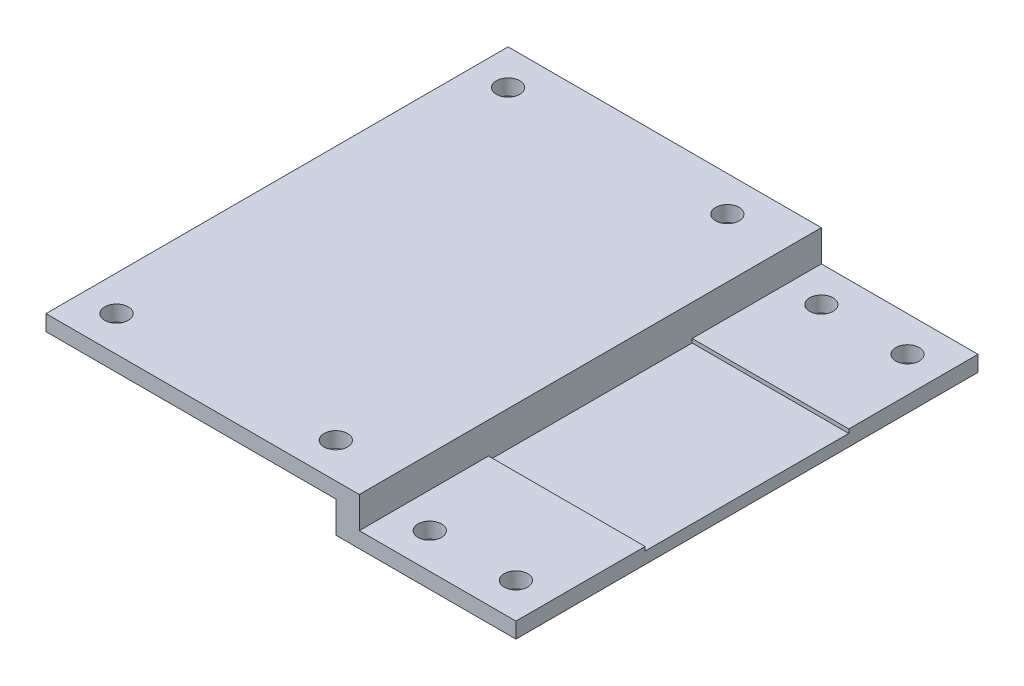
ISO-10303-21;
HEADER;
FILE_DESCRIPTION(('STEP AP214'),'2;1');
FILE_NAME('part.step','',(''),(''),'','','');
FILE_SCHEMA(('AUTOMOTIVE_DESIGN { 1 0 10303 214 1 1 1 1 }'));
ENDSEC;
DATA;
#1=APPLICATION_CONTEXT('core data for automotive mechanical design processes');
#2=APPLICATION_PROTOCOL_DEFINITION('international standard','automotive_design',2000,#1);
#3=PRODUCT_CONTEXT('',#1,'mechanical');
#4=PRODUCT('Part','Part','',(#3));
#5=PRODUCT_RELATED_PRODUCT_CATEGORY('part','',(#4));
#6=PRODUCT_DEFINITION_FORMATION('','',#4);
#7=PRODUCT_DEFINITION_CONTEXT('part definition',#1,'design');
#8=PRODUCT_DEFINITION('design','',#6,#7);
#9=PRODUCT_DEFINITION_SHAPE('','',#8);
#10=(LENGTH_UNIT() NAMED_UNIT(*) SI_UNIT(.MILLI.,.METRE.));
#11=(NAMED_UNIT(*) PLANE_ANGLE_UNIT() SI_UNIT($,.RADIAN.));
#12=(NAMED_UNIT(*) SI_UNIT($,.STERADIAN.) SOLID_ANGLE_UNIT());
#13=UNCERTAINTY_MEASURE_WITH_UNIT(LENGTH_MEASURE(1.E-05),#10,'distance_accuracy_value','');
#14=(GEOMETRIC_REPRESENTATION_CONTEXT(3) GLOBAL_UNCERTAINTY_ASSIGNED_CONTEXT((#13)) GLOBAL_UNIT_ASSIGNED_CONTEXT((#10,
#11,#12)) REPRESENTATION_CONTEXT('',''));
#15=CARTESIAN_POINT('',(0.,0.,0.));
#16=DIRECTION('',(0.,0.,1.));
#17=DIRECTION('',(1.,0.,0.));
#18=AXIS2_PLACEMENT_3D('',#15,#16,#17);
#19=CARTESIAN_POINT('',(51.,-2.,29.5));
#20=DIRECTION('',(0.,-1.,0.));
#21=DIRECTION('',(0.,0.,-1.));
#22=AXIS2_PLACEMENT_3D('',#19,#20,#21);
#23=PLANE('',#22);
#24=CARTESIAN_POINT('',(35.5,-2.,25.));
#25=DIRECTION('',(0.,1.,0.));
#26=DIRECTION('',(0.,0.,1.));
#27=AXIS2_PLACEMENT_3D('',#24,#25,#26);
#28=CIRCLE('',#27,1.5);
#29=CARTESIAN_POINT('',(35.5,-2.,26.5));
#30=VERTEX_POINT('',#29);
#31=EDGE_CURVE('E183',#30,#30,#28,.T.);
#32=ORIENTED_EDGE('',*,*,#31,.F.);
#33=EDGE_LOOP('',(#32));
#34=FACE_BOUND('',#33,.T.);
#35=CARTESIAN_POINT('',(46.5,-2.,25.));
#36=DIRECTION('',(0.,1.,0.));
#37=DIRECTION('',(0.,0.,1.));
#38=AXIS2_PLACEMENT_3D('',#35,#36,#37);
#39=CIRCLE('',#38,1.5);
#40=CARTESIAN_POINT('',(46.5,-2.,26.5));
#41=VERTEX_POINT('',#40);
#42=EDGE_CURVE('E189',#41,#41,#39,.T.);
#43=ORIENTED_EDGE('',*,*,#42,.F.);
#44=EDGE_LOOP('',(#43));
#45=FACE_BOUND('',#44,.T.);
#46=DIRECTION('',(-1.,0.,0.));
#47=VECTOR('',#46,1.);
#48=CARTESIAN_POINT('',(0.,-2.,13.));
#49=LINE('',#48,#47);
#50=CARTESIAN_POINT('',(51.,-2.,13.));
#51=VERTEX_POINT('',#50);
#52=CARTESIAN_POINT('',(31.,-2.,13.));
#53=VERTEX_POINT('',#52);
#54=EDGE_CURVE('E269',#51,#53,#49,.T.);
#55=ORIENTED_EDGE('',*,*,#54,.T.);
#56=DIRECTION('',(0.,0.,1.));
#57=VECTOR('',#56,1.);
#58=CARTESIAN_POINT('',(31.,-2.,29.5));
#59=LINE('',#58,#57);
#60=CARTESIAN_POINT('',(31.,-2.,29.5));
#61=VERTEX_POINT('',#60);
#62=EDGE_CURVE('E207',#53,#61,#59,.T.);
#63=ORIENTED_EDGE('',*,*,#62,.T.);
#64=DIRECTION('',(-1.,0.,0.));
#65=VECTOR('',#64,1.);
#66=CARTESIAN_POINT('',(51.,-2.,29.5));
#67=LINE('',#66,#65);
#68=CARTESIAN_POINT('',(51.,-2.,29.5));
#69=VERTEX_POINT('',#68);
#70=EDGE_CURVE('E219',#69,#61,#67,.T.);
#71=ORIENTED_EDGE('',*,*,#70,.F.);
#72=DIRECTION('',(0.,0.,1.));
#73=VECTOR('',#72,1.);
#74=CARTESIAN_POINT('',(51.,-2.,29.5));
#75=LINE('',#74,#73);
#76=EDGE_CURVE('E217',#51,#69,#75,.T.);
#77=ORIENTED_EDGE('',*,*,#76,.F.);
#78=EDGE_LOOP('',(#55,#63,#71,#77));
#79=FACE_BOUND('',#78,.T.);
#80=ADVANCED_FACE('F36',(#34,#45,#79),#23,.F.);
#81=CARTESIAN_POINT('',(51.,0.,0.));
#82=DIRECTION('',(-1.,0.,0.));
#83=DIRECTION('',(0.,0.,1.));
#84=AXIS2_PLACEMENT_3D('',#81,#82,#83);
#85=PLANE('',#84);
#86=DIRECTION('',(0.,1.,0.));
#87=VECTOR('',#86,1.);
#88=CARTESIAN_POINT('',(51.,-2.5,13.));
#89=LINE('',#88,#87);
#90=CARTESIAN_POINT('',(51.,-2.5,13.));
#91=VERTEX_POINT('',#90);
#92=EDGE_CURVE('E145',#91,#51,#89,.T.);
#93=ORIENTED_EDGE('',*,*,#92,.T.);
#94=ORIENTED_EDGE('',*,*,#76,.T.);
#95=DIRECTION('',(0.,-1.,0.));
#96=VECTOR('',#95,1.);
#97=CARTESIAN_POINT('',(51.,-4.,29.5));
#98=LINE('',#97,#96);
#99=CARTESIAN_POINT('',(51.,-4.,29.5));
#100=VERTEX_POINT('',#99);
#101=EDGE_CURVE('E208',#69,#100,#98,.T.);
#102=ORIENTED_EDGE('',*,*,#101,.T.);
#103=DIRECTION('',(0.,0.,-1.));
#104=VECTOR('',#103,1.);
#105=CARTESIAN_POINT('',(51.,-4.,29.5));
#106=LINE('',#105,#104);
#107=CARTESIAN_POINT('',(51.,-4.,-29.5));
#108=VERTEX_POINT('',#107);
#109=EDGE_CURVE('E211',#100,#108,#106,.T.);
#110=ORIENTED_EDGE('',*,*,#109,.T.);
#111=DIRECTION('',(0.,1.,0.));
#112=VECTOR('',#111,1.);
#113=CARTESIAN_POINT('',(51.,-4.,-29.5));
#114=LINE('',#113,#112);
#115=CARTESIAN_POINT('',(51.,-2.,-29.5));
#116=VERTEX_POINT('',#115);
#117=EDGE_CURVE('E215',#108,#116,#114,.T.);
#118=ORIENTED_EDGE('',*,*,#117,.T.);
#119=CARTESIAN_POINT('',(51.,-2.,-13.));
#120=VERTEX_POINT('',#119);
#121=EDGE_CURVE('E144',#116,#120,#75,.T.);
#122=ORIENTED_EDGE('',*,*,#121,.T.);
#123=DIRECTION('',(0.,1.,0.));
#124=VECTOR('',#123,1.);
#125=CARTESIAN_POINT('',(51.,-2.5,-13.));
#126=LINE('',#125,#124);
#127=CARTESIAN_POINT('',(51.,-2.5,-13.));
#128=VERTEX_POINT('',#127);
#129=EDGE_CURVE('E129',#128,#120,#126,.T.);
#130=ORIENTED_EDGE('',*,*,#129,.F.);
#131=DIRECTION('',(0.,0.,-1.));
#132=VECTOR('',#131,1.);
#133=CARTESIAN_POINT('',(51.,-2.5,0.));
#134=LINE('',#133,#132);
#135=EDGE_CURVE('E134',#91,#128,#134,.T.);
#136=ORIENTED_EDGE('',*,*,#135,.F.);
#137=EDGE_LOOP('',(#93,#94,#102,#110,#118,#122,#130,#136));
#138=FACE_BOUND('',#137,.T.);
#139=ADVANCED_FACE('F142',(#138),#85,.F.);
#140=CARTESIAN_POINT('',(0.,0.,0.));
#141=DIRECTION('',(0.,1.,0.));
#142=DIRECTION('',(0.,0.,1.));
#143=AXIS2_PLACEMENT_3D('',#140,#141,#142);
#144=PLANE('',#143);
#145=CARTESIAN_POINT('',(-4.50000000000001,0.,-25.));
#146=DIRECTION('',(0.,1.,0.));
#147=DIRECTION('',(0.,0.,1.));
#148=AXIS2_PLACEMENT_3D('',#145,#146,#147);
#149=CIRCLE('',#148,1.49999999999999);
#150=CARTESIAN_POINT('',(-4.50000000000001,0.,-23.5));
#151=VERTEX_POINT('',#150);
#152=EDGE_CURVE('E155',#151,#151,#149,.T.);
#153=ORIENTED_EDGE('',*,*,#152,.T.);
#154=EDGE_LOOP('',(#153));
#155=FACE_BOUND('',#154,.T.);
#156=CARTESIAN_POINT('',(-4.50000000000001,0.,25.));
#157=DIRECTION('',(0.,1.,0.));
#158=DIRECTION('',(0.,0.,1.));
#159=AXIS2_PLACEMENT_3D('',#156,#157,#158);
#160=CIRCLE('',#159,1.49999999999999);
#161=CARTESIAN_POINT('',(-4.50000000000001,0.,26.5));
#162=VERTEX_POINT('',#161);
#163=EDGE_CURVE('E161',#162,#162,#160,.T.);
#164=ORIENTED_EDGE('',*,*,#163,.T.);
#165=EDGE_LOOP('',(#164));
#166=FACE_BOUND('',#165,.T.);
#167=CARTESIAN_POINT('',(23.5,0.,25.));
#168=DIRECTION('',(0.,1.,0.));
#169=DIRECTION('',(0.,0.,1.));
#170=AXIS2_PLACEMENT_3D('',#167,#168,#169);
#171=CIRCLE('',#170,1.49999999999999);
#172=CARTESIAN_POINT('',(23.5,0.,26.5));
#173=VERTEX_POINT('',#172);
#174=EDGE_CURVE('E204',#173,#173,#171,.T.);
#175=ORIENTED_EDGE('',*,*,#174,.T.);
#176=EDGE_LOOP('',(#175));
#177=FACE_BOUND('',#176,.T.);
#178=CARTESIAN_POINT('',(23.5,0.,-25.));
#179=DIRECTION('',(0.,1.,0.));
#180=DIRECTION('',(0.,0.,1.));
#181=AXIS2_PLACEMENT_3D('',#178,#179,#180);
#182=CIRCLE('',#181,1.49999999999999);
#183=CARTESIAN_POINT('',(23.5,0.,-23.5));
#184=VERTEX_POINT('',#183);
#185=EDGE_CURVE('E198',#184,#184,#182,.T.);
#186=ORIENTED_EDGE('',*,*,#185,.T.);
#187=EDGE_LOOP('',(#186));
#188=FACE_BOUND('',#187,.T.);
#189=DIRECTION('',(0.,0.,1.));
#190=VECTOR('',#189,1.);
#191=CARTESIAN_POINT('',(-9.00000000000001,0.,-29.5));
#192=LINE('',#191,#190);
#193=CARTESIAN_POINT('',(-9.00000000000001,0.,-29.5));
#194=VERTEX_POINT('',#193);
#195=CARTESIAN_POINT('',(-9.00000000000001,0.,29.5));
#196=VERTEX_POINT('',#195);
#197=EDGE_CURVE('E166',#194,#196,#192,.T.);
#198=ORIENTED_EDGE('',*,*,#197,.F.);
#199=DIRECTION('',(-1.,0.,0.));
#200=VECTOR('',#199,1.);
#201=CARTESIAN_POINT('',(-31.,0.,-29.5));
#202=LINE('',#201,#200);
#203=CARTESIAN_POINT('',(28.,0.,-29.5));
#204=VERTEX_POINT('',#203);
#205=EDGE_CURVE('E242',#204,#194,#202,.T.);
#206=ORIENTED_EDGE('',*,*,#205,.F.);
#207=DIRECTION('',(0.,0.,-1.));
#208=VECTOR('',#207,1.);
#209=CARTESIAN_POINT('',(28.,0.,29.5));
#210=LINE('',#209,#208);
#211=CARTESIAN_POINT('',(28.,0.,29.5));
#212=VERTEX_POINT('',#211);
#213=EDGE_CURVE('E227',#212,#204,#210,.T.);
#214=ORIENTED_EDGE('',*,*,#213,.F.);
#215=DIRECTION('',(1.,0.,0.));
#216=VECTOR('',#215,1.);
#217=CARTESIAN_POINT('',(-31.,0.,29.5));
#218=LINE('',#217,#216);
#219=EDGE_CURVE('E247',#196,#212,#218,.T.);
#220=ORIENTED_EDGE('',*,*,#219,.F.);
#221=EDGE_LOOP('',(#198,#206,#214,#220));
#222=FACE_BOUND('',#221,.T.);
#223=ADVANCED_FACE('F292',(#155,#166,#177,#188,#222),#144,.F.);
#224=CARTESIAN_POINT('',(-31.,2.,-29.5));
#225=DIRECTION('',(0.,0.,1.));
#226=DIRECTION('',(1.,0.,0.));
#227=AXIS2_PLACEMENT_3D('',#224,#225,#226);
#228=PLANE('',#227);
#229=DIRECTION('',(0.,-1.,0.));
#230=VECTOR('',#229,1.);
#231=CARTESIAN_POINT('',(-9.00000000000001,2.,-29.5));
#232=LINE('',#231,#230);
#233=CARTESIAN_POINT('',(-9.00000000000001,2.,-29.5));
#234=VERTEX_POINT('',#233);
#235=EDGE_CURVE('E164',#234,#194,#232,.T.);
#236=ORIENTED_EDGE('',*,*,#235,.F.);
#237=DIRECTION('',(-1.,0.,0.));
#238=VECTOR('',#237,1.);
#239=CARTESIAN_POINT('',(-31.,2.,-29.5));
#240=LINE('',#239,#238);
#241=CARTESIAN_POINT('',(31.,2.,-29.5));
#242=VERTEX_POINT('',#241);
#243=EDGE_CURVE('E246',#242,#234,#240,.T.);
#244=ORIENTED_EDGE('',*,*,#243,.F.);
#245=DIRECTION('',(0.,-1.,0.));
#246=VECTOR('',#245,1.);
#247=CARTESIAN_POINT('',(31.,2.,-29.5));
#248=LINE('',#247,#246);
#249=CARTESIAN_POINT('',(31.,-2.,-29.5));
#250=VERTEX_POINT('',#249);
#251=EDGE_CURVE('E11',#242,#250,#248,.T.);
#252=ORIENTED_EDGE('',*,*,#251,.T.);
#253=DIRECTION('',(-1.,0.,0.));
#254=VECTOR('',#253,1.);
#255=CARTESIAN_POINT('',(51.,-2.,-29.5));
#256=LINE('',#255,#254);
#257=EDGE_CURVE('E224',#116,#250,#256,.T.);
#258=ORIENTED_EDGE('',*,*,#257,.F.);
#259=ORIENTED_EDGE('',*,*,#117,.F.);
#260=DIRECTION('',(1.,0.,0.));
#261=VECTOR('',#260,1.);
#262=CARTESIAN_POINT('',(31.,-4.,-29.5));
#263=LINE('',#262,#261);
#264=CARTESIAN_POINT('',(28.,-4.,-29.5));
#265=VERTEX_POINT('',#264);
#266=EDGE_CURVE('E232',#265,#108,#263,.T.);
#267=ORIENTED_EDGE('',*,*,#266,.F.);
#268=DIRECTION('',(0.,1.,0.));
#269=VECTOR('',#268,1.);
#270=CARTESIAN_POINT('',(28.,-4.,-29.5));
#271=LINE('',#270,#269);
#272=EDGE_CURVE('E234',#265,#204,#271,.T.);
#273=ORIENTED_EDGE('',*,*,#272,.T.);
#274=ORIENTED_EDGE('',*,*,#205,.T.);
#275=EDGE_LOOP('',(#236,#244,#252,#258,#259,#267,#273,#274));
#276=FACE_BOUND('',#275,.T.);
#277=ADVANCED_FACE('F283',(#276),#228,.F.);
#278=CARTESIAN_POINT('',(-31.,2.,29.5));
#279=DIRECTION('',(0.,0.,-1.));
#280=DIRECTION('',(-1.,0.,0.));
#281=AXIS2_PLACEMENT_3D('',#278,#279,#280);
#282=PLANE('',#281);
#283=DIRECTION('',(0.,1.,0.));
#284=VECTOR('',#283,1.);
#285=CARTESIAN_POINT('',(-9.00000000000001,2.,29.5));
#286=LINE('',#285,#284);
#287=CARTESIAN_POINT('',(-9.00000000000001,2.,29.5));
#288=VERTEX_POINT('',#287);
#289=EDGE_CURVE('E59',#196,#288,#286,.T.);
#290=ORIENTED_EDGE('',*,*,#289,.F.);
#291=ORIENTED_EDGE('',*,*,#219,.T.);
#292=DIRECTION('',(0.,1.,0.));
#293=VECTOR('',#292,1.);
#294=CARTESIAN_POINT('',(28.,-4.,29.5));
#295=LINE('',#294,#293);
#296=CARTESIAN_POINT('',(28.,-4.,29.5));
#297=VERTEX_POINT('',#296);
#298=EDGE_CURVE('E239',#297,#212,#295,.T.);
#299=ORIENTED_EDGE('',*,*,#298,.F.);
#300=DIRECTION('',(-1.,0.,0.));
#301=VECTOR('',#300,1.);
#302=CARTESIAN_POINT('',(31.,-4.,29.5));
#303=LINE('',#302,#301);
#304=EDGE_CURVE('E228',#100,#297,#303,.T.);
#305=ORIENTED_EDGE('',*,*,#304,.F.);
#306=ORIENTED_EDGE('',*,*,#101,.F.);
#307=ORIENTED_EDGE('',*,*,#70,.T.);
#308=DIRECTION('',(0.,-1.,0.));
#309=VECTOR('',#308,1.);
#310=CARTESIAN_POINT('',(31.,2.,29.5));
#311=LINE('',#310,#309);
#312=CARTESIAN_POINT('',(31.,2.,29.5));
#313=VERTEX_POINT('',#312);
#314=EDGE_CURVE('E44',#313,#61,#311,.T.);
#315=ORIENTED_EDGE('',*,*,#314,.F.);
#316=DIRECTION('',(1.,0.,0.));
#317=VECTOR('',#316,1.);
#318=CARTESIAN_POINT('',(-31.,2.,29.5));
#319=LINE('',#318,#317);
#320=EDGE_CURVE('E250',#288,#313,#319,.T.);
#321=ORIENTED_EDGE('',*,*,#320,.F.);
#322=EDGE_LOOP('',(#290,#291,#299,#305,#306,#307,#315,#321));
#323=FACE_BOUND('',#322,.T.);
#324=ADVANCED_FACE('F265',(#323),#282,.F.);
#325=CARTESIAN_POINT('',(0.,2.,0.));
#326=DIRECTION('',(0.,1.,0.));
#327=DIRECTION('',(0.,0.,1.));
#328=AXIS2_PLACEMENT_3D('',#325,#326,#327);
#329=PLANE('',#328);
#330=CARTESIAN_POINT('',(-4.50000000000001,2.,-25.));
#331=DIRECTION('',(0.,1.,0.));
#332=DIRECTION('',(0.,0.,1.));
#333=AXIS2_PLACEMENT_3D('',#330,#331,#332);
#334=CIRCLE('',#333,1.49999999999999);
#335=CARTESIAN_POINT('',(-4.50000000000001,2.,-23.5));
#336=VERTEX_POINT('',#335);
#337=EDGE_CURVE('E152',#336,#336,#334,.T.);
#338=ORIENTED_EDGE('',*,*,#337,.F.);
#339=EDGE_LOOP('',(#338));
#340=FACE_BOUND('',#339,.T.);
#341=CARTESIAN_POINT('',(-4.50000000000001,2.,25.));
#342=DIRECTION('',(0.,1.,0.));
#343=DIRECTION('',(0.,0.,1.));
#344=AXIS2_PLACEMENT_3D('',#341,#342,#343);
#345=CIRCLE('',#344,1.49999999999999);
#346=CARTESIAN_POINT('',(-4.50000000000001,2.,26.5));
#347=VERTEX_POINT('',#346);
#348=EDGE_CURVE('E158',#347,#347,#345,.T.);
#349=ORIENTED_EDGE('',*,*,#348,.F.);
#350=EDGE_LOOP('',(#349));
#351=FACE_BOUND('',#350,.T.);
#352=CARTESIAN_POINT('',(23.5,2.,25.));
#353=DIRECTION('',(0.,1.,0.));
#354=DIRECTION('',(0.,0.,1.));
#355=AXIS2_PLACEMENT_3D('',#352,#353,#354);
#356=CIRCLE('',#355,1.49999999999999);
#357=CARTESIAN_POINT('',(23.5,2.,26.5));
#358=VERTEX_POINT('',#357);
#359=EDGE_CURVE('E201',#358,#358,#356,.T.);
#360=ORIENTED_EDGE('',*,*,#359,.F.);
#361=EDGE_LOOP('',(#360));
#362=FACE_BOUND('',#361,.T.);
#363=CARTESIAN_POINT('',(23.5,2.,-25.));
#364=DIRECTION('',(0.,1.,0.));
#365=DIRECTION('',(0.,0.,1.));
#366=AXIS2_PLACEMENT_3D('',#363,#364,#365);
#367=CIRCLE('',#366,1.49999999999999);
#368=CARTESIAN_POINT('',(23.5,2.,-23.5));
#369=VERTEX_POINT('',#368);
#370=EDGE_CURVE('E195',#369,#369,#367,.T.);
#371=ORIENTED_EDGE('',*,*,#370,.F.);
#372=EDGE_LOOP('',(#371));
#373=FACE_BOUND('',#372,.T.);
#374=ORIENTED_EDGE('',*,*,#243,.T.);
#375=DIRECTION('',(0.,0.,-1.));
#376=VECTOR('',#375,1.);
#377=CARTESIAN_POINT('',(-9.00000000000001,2.,-29.5));
#378=LINE('',#377,#376);
#379=EDGE_CURVE('E169',#288,#234,#378,.T.);
#380=ORIENTED_EDGE('',*,*,#379,.F.);
#381=ORIENTED_EDGE('',*,*,#320,.T.);
#382=DIRECTION('',(0.,0.,-1.));
#383=VECTOR('',#382,1.);
#384=CARTESIAN_POINT('',(31.,2.,-29.5));
#385=LINE('',#384,#383);
#386=EDGE_CURVE('E243',#313,#242,#385,.T.);
#387=ORIENTED_EDGE('',*,*,#386,.T.);
#388=EDGE_LOOP('',(#374,#380,#381,#387));
#389=FACE_BOUND('',#388,.T.);
#390=ADVANCED_FACE('F286',(#340,#351,#362,#373,#389),#329,.T.);
#391=CARTESIAN_POINT('',(46.5,-2.,-25.));
#392=DIRECTION('',(0.,1.,0.));
#393=DIRECTION('',(0.,0.,1.));
#394=AXIS2_PLACEMENT_3D('',#391,#392,#393);
#395=CIRCLE('',#394,1.5);
#396=CARTESIAN_POINT('',(46.5,-2.,-23.5));
#397=VERTEX_POINT('',#396);
#398=EDGE_CURVE('E177',#397,#397,#395,.T.);
#399=ORIENTED_EDGE('',*,*,#398,.F.);
#400=EDGE_LOOP('',(#399));
#401=FACE_BOUND('',#400,.T.);
#402=CARTESIAN_POINT('',(31.,-2.,-13.));
#403=VERTEX_POINT('',#402);
#404=EDGE_CURVE('E212',#250,#403,#59,.T.);
#405=ORIENTED_EDGE('',*,*,#404,.T.);
#406=DIRECTION('',(-1.,0.,0.));
#407=VECTOR('',#406,1.);
#408=CARTESIAN_POINT('',(0.,-2.,-13.));
#409=LINE('',#408,#407);
#410=EDGE_CURVE('E271',#120,#403,#409,.T.);
#411=ORIENTED_EDGE('',*,*,#410,.F.);
#412=ORIENTED_EDGE('',*,*,#121,.F.);
#413=ORIENTED_EDGE('',*,*,#257,.T.);
#414=EDGE_LOOP('',(#405,#411,#412,#413));
#415=FACE_BOUND('',#414,.T.);
#416=CARTESIAN_POINT('',(35.5,-2.,-25.));
#417=DIRECTION('',(0.,1.,0.));
#418=DIRECTION('',(0.,0.,1.));
#419=AXIS2_PLACEMENT_3D('',#416,#417,#418);
#420=CIRCLE('',#419,1.5);
#421=CARTESIAN_POINT('',(35.5,-2.,-23.5));
#422=VERTEX_POINT('',#421);
#423=EDGE_CURVE('E171',#422,#422,#420,.T.);
#424=ORIENTED_EDGE('',*,*,#423,.F.);
#425=EDGE_LOOP('',(#424));
#426=FACE_BOUND('',#425,.T.);
#427=ADVANCED_FACE('F277',(#401,#415,#426),#23,.F.);
#428=CARTESIAN_POINT('',(31.,2.,-29.5));
#429=DIRECTION('',(-1.,0.,0.));
#430=DIRECTION('',(0.,0.,1.));
#431=AXIS2_PLACEMENT_3D('',#428,#429,#430);
#432=PLANE('',#431);
#433=ORIENTED_EDGE('',*,*,#404,.F.);
#434=ORIENTED_EDGE('',*,*,#251,.F.);
#435=ORIENTED_EDGE('',*,*,#386,.F.);
#436=ORIENTED_EDGE('',*,*,#314,.T.);
#437=ORIENTED_EDGE('',*,*,#62,.F.);
#438=DIRECTION('',(0.,1.,0.));
#439=VECTOR('',#438,1.);
#440=CARTESIAN_POINT('',(31.,-2.5,13.));
#441=LINE('',#440,#439);
#442=CARTESIAN_POINT('',(31.,-2.5,13.));
#443=VERTEX_POINT('',#442);
#444=EDGE_CURVE('E147',#443,#53,#441,.T.);
#445=ORIENTED_EDGE('',*,*,#444,.F.);
#446=DIRECTION('',(0.,0.,1.));
#447=VECTOR('',#446,1.);
#448=CARTESIAN_POINT('',(31.,-2.5,0.));
#449=LINE('',#448,#447);
#450=CARTESIAN_POINT('',(31.,-2.5,-13.));
#451=VERTEX_POINT('',#450);
#452=EDGE_CURVE('E133',#451,#443,#449,.T.);
#453=ORIENTED_EDGE('',*,*,#452,.F.);
#454=DIRECTION('',(0.,1.,0.));
#455=VECTOR('',#454,1.);
#456=CARTESIAN_POINT('',(31.,-2.5,-13.));
#457=LINE('',#456,#455);
#458=EDGE_CURVE('E131',#451,#403,#457,.T.);
#459=ORIENTED_EDGE('',*,*,#458,.T.);
#460=EDGE_LOOP('',(#433,#434,#435,#436,#437,#445,#453,#459));
#461=FACE_BOUND('',#460,.T.);
#462=ADVANCED_FACE('F38',(#461),#432,.F.);
#463=CARTESIAN_POINT('',(28.,-4.,29.5));
#464=DIRECTION('',(1.,0.,0.));
#465=DIRECTION('',(0.,0.,-1.));
#466=AXIS2_PLACEMENT_3D('',#463,#464,#465);
#467=PLANE('',#466);
#468=ORIENTED_EDGE('',*,*,#213,.T.);
#469=ORIENTED_EDGE('',*,*,#272,.F.);
#470=DIRECTION('',(0.,0.,-1.));
#471=VECTOR('',#470,1.);
#472=CARTESIAN_POINT('',(28.,-4.,29.5));
#473=LINE('',#472,#471);
#474=EDGE_CURVE('E230',#297,#265,#473,.T.);
#475=ORIENTED_EDGE('',*,*,#474,.F.);
#476=ORIENTED_EDGE('',*,*,#298,.T.);
#477=EDGE_LOOP('',(#468,#469,#475,#476));
#478=FACE_BOUND('',#477,.T.);
#479=ADVANCED_FACE('F296',(#478),#467,.F.);
#480=CARTESIAN_POINT('',(0.,-4.,0.));
#481=DIRECTION('',(0.,1.,0.));
#482=DIRECTION('',(0.,0.,1.));
#483=AXIS2_PLACEMENT_3D('',#480,#481,#482);
#484=PLANE('',#483);
#485=CARTESIAN_POINT('',(35.5,-4.,-25.));
#486=DIRECTION('',(0.,1.,0.));
#487=DIRECTION('',(0.,0.,1.));
#488=AXIS2_PLACEMENT_3D('',#485,#486,#487);
#489=CIRCLE('',#488,1.5);
#490=CARTESIAN_POINT('',(35.5,-4.,-23.5));
#491=VERTEX_POINT('',#490);
#492=EDGE_CURVE('E174',#491,#491,#489,.T.);
#493=ORIENTED_EDGE('',*,*,#492,.T.);
#494=EDGE_LOOP('',(#493));
#495=FACE_BOUND('',#494,.T.);
#496=CARTESIAN_POINT('',(46.5,-4.,-25.));
#497=DIRECTION('',(0.,1.,0.));
#498=DIRECTION('',(0.,0.,1.));
#499=AXIS2_PLACEMENT_3D('',#496,#497,#498);
#500=CIRCLE('',#499,1.5);
#501=CARTESIAN_POINT('',(46.5,-4.,-23.5));
#502=VERTEX_POINT('',#501);
#503=EDGE_CURVE('E180',#502,#502,#500,.T.);
#504=ORIENTED_EDGE('',*,*,#503,.T.);
#505=EDGE_LOOP('',(#504));
#506=FACE_BOUND('',#505,.T.);
#507=CARTESIAN_POINT('',(35.5,-4.,25.));
#508=DIRECTION('',(0.,1.,0.));
#509=DIRECTION('',(0.,0.,1.));
#510=AXIS2_PLACEMENT_3D('',#507,#508,#509);
#511=CIRCLE('',#510,1.5);
#512=CARTESIAN_POINT('',(35.5,-4.,26.5));
#513=VERTEX_POINT('',#512);
#514=EDGE_CURVE('E186',#513,#513,#511,.T.);
#515=ORIENTED_EDGE('',*,*,#514,.T.);
#516=EDGE_LOOP('',(#515));
#517=FACE_BOUND('',#516,.T.);
#518=CARTESIAN_POINT('',(46.5,-4.,25.));
#519=DIRECTION('',(0.,1.,0.));
#520=DIRECTION('',(0.,0.,1.));
#521=AXIS2_PLACEMENT_3D('',#518,#519,#520);
#522=CIRCLE('',#521,1.5);
#523=CARTESIAN_POINT('',(46.5,-4.,26.5));
#524=VERTEX_POINT('',#523);
#525=EDGE_CURVE('E192',#524,#524,#522,.T.);
#526=ORIENTED_EDGE('',*,*,#525,.T.);
#527=EDGE_LOOP('',(#526));
#528=FACE_BOUND('',#527,.T.);
#529=ORIENTED_EDGE('',*,*,#266,.T.);
#530=ORIENTED_EDGE('',*,*,#109,.F.);
#531=ORIENTED_EDGE('',*,*,#304,.T.);
#532=ORIENTED_EDGE('',*,*,#474,.T.);
#533=EDGE_LOOP('',(#529,#530,#531,#532));
#534=FACE_BOUND('',#533,.T.);
#535=ADVANCED_FACE('F299',(#495,#506,#517,#528,#534),#484,.F.);
#536=CARTESIAN_POINT('',(23.5,2.,25.));
#537=DIRECTION('',(0.,1.,0.));
#538=DIRECTION('',(0.,0.,1.));
#539=AXIS2_PLACEMENT_3D('',#536,#537,#538);
#540=CYLINDRICAL_SURFACE('',#539,1.49999999999999);
#541=ORIENTED_EDGE('',*,*,#359,.T.);
#542=EDGE_LOOP('',(#541));
#543=FACE_BOUND('',#542,.T.);
#544=ORIENTED_EDGE('',*,*,#174,.F.);
#545=EDGE_LOOP('',(#544));
#546=FACE_BOUND('',#545,.T.);
#547=ADVANCED_FACE('F301',(#543,#546),#540,.F.);
#548=CARTESIAN_POINT('',(23.5,2.,-25.));
#549=DIRECTION('',(0.,1.,0.));
#550=DIRECTION('',(0.,0.,1.));
#551=AXIS2_PLACEMENT_3D('',#548,#549,#550);
#552=CYLINDRICAL_SURFACE('',#551,1.49999999999999);
#553=ORIENTED_EDGE('',*,*,#370,.T.);
#554=EDGE_LOOP('',(#553));
#555=FACE_BOUND('',#554,.T.);
#556=ORIENTED_EDGE('',*,*,#185,.F.);
#557=EDGE_LOOP('',(#556));
#558=FACE_BOUND('',#557,.T.);
#559=ADVANCED_FACE('F308',(#555,#558),#552,.F.);
#560=CARTESIAN_POINT('',(46.5,-2.,25.));
#561=DIRECTION('',(0.,1.,0.));
#562=DIRECTION('',(0.,0.,1.));
#563=AXIS2_PLACEMENT_3D('',#560,#561,#562);
#564=CYLINDRICAL_SURFACE('',#563,1.5);
#565=ORIENTED_EDGE('',*,*,#525,.F.);
#566=EDGE_LOOP('',(#565));
#567=FACE_BOUND('',#566,.T.);
#568=ORIENTED_EDGE('',*,*,#42,.T.);
#569=EDGE_LOOP('',(#568));
#570=FACE_BOUND('',#569,.T.);
#571=ADVANCED_FACE('F345',(#567,#570),#564,.F.);
#572=CARTESIAN_POINT('',(35.5,-2.,25.));
#573=DIRECTION('',(0.,1.,0.));
#574=DIRECTION('',(0.,0.,1.));
#575=AXIS2_PLACEMENT_3D('',#572,#573,#574);
#576=CYLINDRICAL_SURFACE('',#575,1.5);
#577=ORIENTED_EDGE('',*,*,#514,.F.);
#578=EDGE_LOOP('',(#577));
#579=FACE_BOUND('',#578,.T.);
#580=ORIENTED_EDGE('',*,*,#31,.T.);
#581=EDGE_LOOP('',(#580));
#582=FACE_BOUND('',#581,.T.);
#583=ADVANCED_FACE('F335',(#579,#582),#576,.F.);
#584=CARTESIAN_POINT('',(46.5,-2.,-25.));
#585=DIRECTION('',(0.,1.,0.));
#586=DIRECTION('',(0.,0.,1.));
#587=AXIS2_PLACEMENT_3D('',#584,#585,#586);
#588=CYLINDRICAL_SURFACE('',#587,1.5);
#589=ORIENTED_EDGE('',*,*,#503,.F.);
#590=EDGE_LOOP('',(#589));
#591=FACE_BOUND('',#590,.T.);
#592=ORIENTED_EDGE('',*,*,#398,.T.);
#593=EDGE_LOOP('',(#592));
#594=FACE_BOUND('',#593,.T.);
#595=ADVANCED_FACE('F332',(#591,#594),#588,.F.);
#596=CARTESIAN_POINT('',(35.5,-2.,-25.));
#597=DIRECTION('',(0.,1.,0.));
#598=DIRECTION('',(0.,0.,1.));
#599=AXIS2_PLACEMENT_3D('',#596,#597,#598);
#600=CYLINDRICAL_SURFACE('',#599,1.5);
#601=ORIENTED_EDGE('',*,*,#492,.F.);
#602=EDGE_LOOP('',(#601));
#603=FACE_BOUND('',#602,.T.);
#604=ORIENTED_EDGE('',*,*,#423,.T.);
#605=EDGE_LOOP('',(#604));
#606=FACE_BOUND('',#605,.T.);
#607=ADVANCED_FACE('F334',(#603,#606),#600,.F.);
#608=CARTESIAN_POINT('',(-9.00000000000001,0.,0.));
#609=DIRECTION('',(-1.,0.,0.));
#610=DIRECTION('',(0.,0.,1.));
#611=AXIS2_PLACEMENT_3D('',#608,#609,#610);
#612=PLANE('',#611);
#613=ORIENTED_EDGE('',*,*,#235,.T.);
#614=ORIENTED_EDGE('',*,*,#197,.T.);
#615=ORIENTED_EDGE('',*,*,#289,.T.);
#616=ORIENTED_EDGE('',*,*,#379,.T.);
#617=EDGE_LOOP('',(#613,#614,#615,#616));
#618=FACE_BOUND('',#617,.T.);
#619=ADVANCED_FACE('F342',(#618),#612,.T.);
#620=CARTESIAN_POINT('',(-4.50000000000001,2.,25.));
#621=DIRECTION('',(0.,1.,0.));
#622=DIRECTION('',(0.,0.,1.));
#623=AXIS2_PLACEMENT_3D('',#620,#621,#622);
#624=CYLINDRICAL_SURFACE('',#623,1.49999999999999);
#625=ORIENTED_EDGE('',*,*,#348,.T.);
#626=EDGE_LOOP('',(#625));
#627=FACE_BOUND('',#626,.T.);
#628=ORIENTED_EDGE('',*,*,#163,.F.);
#629=EDGE_LOOP('',(#628));
#630=FACE_BOUND('',#629,.T.);
#631=ADVANCED_FACE('F389',(#627,#630),#624,.F.);
#632=CARTESIAN_POINT('',(-4.50000000000001,2.,-25.));
#633=DIRECTION('',(0.,1.,0.));
#634=DIRECTION('',(0.,0.,1.));
#635=AXIS2_PLACEMENT_3D('',#632,#633,#634);
#636=CYLINDRICAL_SURFACE('',#635,1.49999999999999);
#637=ORIENTED_EDGE('',*,*,#337,.T.);
#638=EDGE_LOOP('',(#637));
#639=FACE_BOUND('',#638,.T.);
#640=ORIENTED_EDGE('',*,*,#152,.F.);
#641=EDGE_LOOP('',(#640));
#642=FACE_BOUND('',#641,.T.);
#643=ADVANCED_FACE('F395',(#639,#642),#636,.F.);
#644=CARTESIAN_POINT('',(0.,-2.5,13.));
#645=DIRECTION('',(0.,0.,-1.));
#646=DIRECTION('',(-1.,0.,0.));
#647=AXIS2_PLACEMENT_3D('',#644,#645,#646);
#648=PLANE('',#647);
#649=ORIENTED_EDGE('',*,*,#54,.F.);
#650=ORIENTED_EDGE('',*,*,#92,.F.);
#651=DIRECTION('',(-1.,0.,0.));
#652=VECTOR('',#651,1.);
#653=CARTESIAN_POINT('',(0.,-2.5,13.));
#654=LINE('',#653,#652);
#655=EDGE_CURVE('E51',#91,#443,#654,.T.);
#656=ORIENTED_EDGE('',*,*,#655,.T.);
#657=ORIENTED_EDGE('',*,*,#444,.T.);
#658=EDGE_LOOP('',(#649,#650,#656,#657));
#659=FACE_BOUND('',#658,.T.);
#660=ADVANCED_FACE('F275',(#659),#648,.T.);
#661=CARTESIAN_POINT('',(0.,-2.5,-13.));
#662=DIRECTION('',(0.,0.,-1.));
#663=DIRECTION('',(-1.,0.,0.));
#664=AXIS2_PLACEMENT_3D('',#661,#662,#663);
#665=PLANE('',#664);
#666=ORIENTED_EDGE('',*,*,#410,.T.);
#667=ORIENTED_EDGE('',*,*,#458,.F.);
#668=DIRECTION('',(-1.,0.,0.));
#669=VECTOR('',#668,1.);
#670=CARTESIAN_POINT('',(0.,-2.5,-13.));
#671=LINE('',#670,#669);
#672=EDGE_CURVE('E125',#128,#451,#671,.T.);
#673=ORIENTED_EDGE('',*,*,#672,.F.);
#674=ORIENTED_EDGE('',*,*,#129,.T.);
#675=EDGE_LOOP('',(#666,#667,#673,#674));
#676=FACE_BOUND('',#675,.T.);
#677=ADVANCED_FACE('F127',(#676),#665,.F.);
#678=CARTESIAN_POINT('',(0.,-2.5,0.));
#679=DIRECTION('',(0.,1.,0.));
#680=DIRECTION('',(0.,0.,1.));
#681=AXIS2_PLACEMENT_3D('',#678,#679,#680);
#682=PLANE('',#681);
#683=ORIENTED_EDGE('',*,*,#655,.F.);
#684=ORIENTED_EDGE('',*,*,#135,.T.);
#685=ORIENTED_EDGE('',*,*,#672,.T.);
#686=ORIENTED_EDGE('',*,*,#452,.T.);
#687=EDGE_LOOP('',(#683,#684,#685,#686));
#688=FACE_BOUND('',#687,.T.);
#689=ADVANCED_FACE('F137',(#688),#682,.T.);
#690=CLOSED_SHELL('',(#80,#139,#223,#277,#324,#390,#427,#462,#479,#535,#547,#559,#571,#583,#595,
#607,#619,#631,#643,#660,#677,#689));
#691=MANIFOLD_SOLID_BREP('B2',#690);
#692=ADVANCED_BREP_SHAPE_REPRESENTATION('',(#18,#691),#14);
#693=SHAPE_DEFINITION_REPRESENTATION(#9,#692);
ENDSEC;
END-ISO-10303-21;
